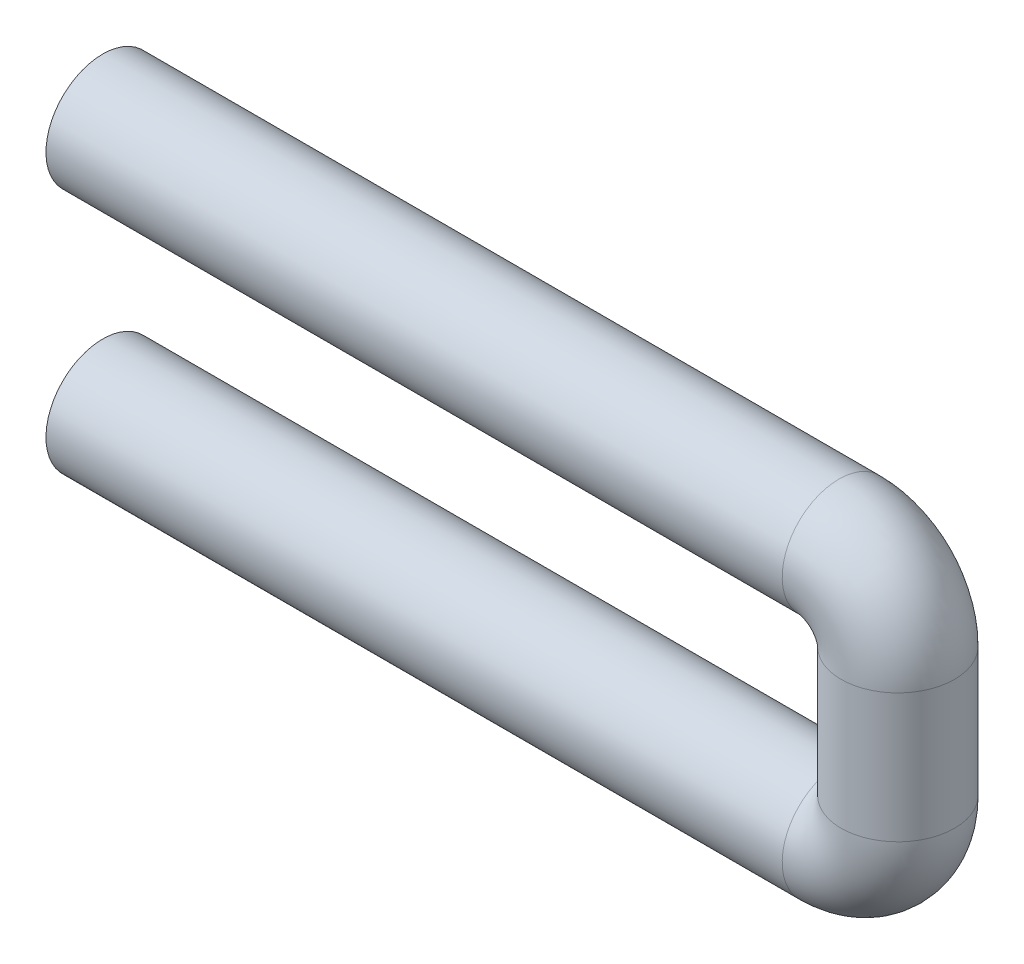
ISO-10303-21;
HEADER;
FILE_DESCRIPTION(('STEP AP214'),'2;1');
FILE_NAME('part.step','',(''),(''),'','','');
FILE_SCHEMA(('AUTOMOTIVE_DESIGN { 1 0 10303 214 1 1 1 1 }'));
ENDSEC;
DATA;
#1=APPLICATION_CONTEXT('core data for automotive mechanical design processes');
#2=APPLICATION_PROTOCOL_DEFINITION('international standard','automotive_design',2000,#1);
#3=PRODUCT_CONTEXT('',#1,'mechanical');
#4=PRODUCT('Part','Part','',(#3));
#5=PRODUCT_RELATED_PRODUCT_CATEGORY('part','',(#4));
#6=PRODUCT_DEFINITION_FORMATION('','',#4);
#7=PRODUCT_DEFINITION_CONTEXT('part definition',#1,'design');
#8=PRODUCT_DEFINITION('design','',#6,#7);
#9=PRODUCT_DEFINITION_SHAPE('','',#8);
#10=(LENGTH_UNIT() NAMED_UNIT(*) SI_UNIT(.MILLI.,.METRE.));
#11=(NAMED_UNIT(*) PLANE_ANGLE_UNIT() SI_UNIT($,.RADIAN.));
#12=(NAMED_UNIT(*) SI_UNIT($,.STERADIAN.) SOLID_ANGLE_UNIT());
#13=UNCERTAINTY_MEASURE_WITH_UNIT(LENGTH_MEASURE(1.E-05),#10,'distance_accuracy_value','');
#14=(GEOMETRIC_REPRESENTATION_CONTEXT(3) GLOBAL_UNCERTAINTY_ASSIGNED_CONTEXT((#13)) GLOBAL_UNIT_ASSIGNED_CONTEXT((#10,
#11,#12)) REPRESENTATION_CONTEXT('',''));
#15=CARTESIAN_POINT('',(0.,0.,0.));
#16=DIRECTION('',(0.,0.,1.));
#17=DIRECTION('',(1.,0.,0.));
#18=AXIS2_PLACEMENT_3D('',#15,#16,#17);
#19=CARTESIAN_POINT('',(10.3845432316119,-3.93310463849465,0.));
#20=DIRECTION('',(-1.,0.,0.));
#21=DIRECTION('',(0.,0.,1.));
#22=AXIS2_PLACEMENT_3D('',#19,#20,#21);
#23=CYLINDRICAL_SURFACE('',#22,1.3);
#24=CARTESIAN_POINT('',(10.3845432316119,-3.93310463849465,0.));
#25=DIRECTION('',(1.,0.,0.));
#26=DIRECTION('',(0.,1.,0.));
#27=AXIS2_PLACEMENT_3D('',#24,#25,#26);
#28=CIRCLE('',#27,1.3);
#29=CARTESIAN_POINT('',(10.3845432316119,-2.63310463849465,0.));
#30=VERTEX_POINT('',#29);
#31=EDGE_CURVE('E34',#30,#30,#28,.T.);
#32=ORIENTED_EDGE('',*,*,#31,.F.);
#33=EDGE_LOOP('',(#32));
#34=FACE_BOUND('',#33,.T.);
#35=CARTESIAN_POINT('',(-6.4854567683881,-3.93310463849465,0.));
#36=DIRECTION('',(1.,0.,0.));
#37=DIRECTION('',(0.,1.,0.));
#38=AXIS2_PLACEMENT_3D('',#35,#36,#37);
#39=CIRCLE('',#38,1.3);
#40=CARTESIAN_POINT('',(-6.48545676838814,-2.63310463849465,0.));
#41=VERTEX_POINT('',#40);
#42=EDGE_CURVE('E10',#41,#41,#39,.T.);
#43=ORIENTED_EDGE('',*,*,#42,.T.);
#44=EDGE_LOOP('',(#43));
#45=FACE_BOUND('',#44,.T.);
#46=ADVANCED_FACE('F28',(#34,#45),#23,.T.);
#47=CARTESIAN_POINT('',(10.3845432316119,-5.28310463849465,0.));
#48=DIRECTION('',(0.,0.,1.));
#49=DIRECTION('',(1.,0.,0.));
#50=AXIS2_PLACEMENT_3D('',#47,#48,#49);
#51=TOROIDAL_SURFACE('',#50,1.35,1.3);
#52=CARTESIAN_POINT('',(11.7345432316119,-5.28310463849466,0.));
#53=DIRECTION('',(0.,-1.,0.));
#54=DIRECTION('',(1.,0.,0.));
#55=AXIS2_PLACEMENT_3D('',#52,#53,#54);
#56=CIRCLE('',#55,1.3);
#57=CARTESIAN_POINT('',(13.0345432316119,-5.28310463849467,0.));
#58=VERTEX_POINT('',#57);
#59=EDGE_CURVE('E38',#58,#58,#56,.T.);
#60=CARTESIAN_POINT('',(10.3845432316119,-5.28310463849465,0.));
#61=DIRECTION('',(0.,0.,1.));
#62=DIRECTION('',(1.,0.,0.));
#63=AXIS2_PLACEMENT_3D('',#60,#61,#62);
#64=CIRCLE('',#63,2.65);
#65=EDGE_CURVE('',#58,#30,#64,.T.);
#66=ORIENTED_EDGE('',*,*,#59,.F.);
#67=ORIENTED_EDGE('',*,*,#31,.T.);
#68=ORIENTED_EDGE('',*,*,#65,.T.);
#69=ORIENTED_EDGE('',*,*,#65,.F.);
#70=EDGE_LOOP('',(#66,#68,#67,#69));
#71=FACE_BOUND('',#70,.T.);
#72=ADVANCED_FACE('F66',(#71),#51,.T.);
#73=CARTESIAN_POINT('',(11.7345432316119,-8.23774244494762,0.));
#74=DIRECTION('',(0.,1.,0.));
#75=DIRECTION('',(0.,0.,1.));
#76=AXIS2_PLACEMENT_3D('',#73,#74,#75);
#77=CYLINDRICAL_SURFACE('',#76,1.3);
#78=CARTESIAN_POINT('',(11.7345432316119,-8.23774244494762,0.));
#79=DIRECTION('',(0.,-1.,0.));
#80=DIRECTION('',(1.,0.,0.));
#81=AXIS2_PLACEMENT_3D('',#78,#79,#80);
#82=CIRCLE('',#81,1.3);
#83=CARTESIAN_POINT('',(13.0345432316119,-8.23774244494761,0.));
#84=VERTEX_POINT('',#83);
#85=EDGE_CURVE('E42',#84,#84,#82,.T.);
#86=ORIENTED_EDGE('',*,*,#85,.F.);
#87=EDGE_LOOP('',(#86));
#88=FACE_BOUND('',#87,.T.);
#89=ORIENTED_EDGE('',*,*,#59,.T.);
#90=EDGE_LOOP('',(#89));
#91=FACE_BOUND('',#90,.T.);
#92=ADVANCED_FACE('F60',(#88,#91),#77,.T.);
#93=CARTESIAN_POINT('',(10.3845432316119,-8.23774244494763,0.));
#94=DIRECTION('',(0.,0.,1.));
#95=DIRECTION('',(1.,0.,0.));
#96=AXIS2_PLACEMENT_3D('',#93,#94,#95);
#97=TOROIDAL_SURFACE('',#96,1.35,1.3);
#98=CARTESIAN_POINT('',(10.3845432316119,-9.58774244494763,0.));
#99=DIRECTION('',(-1.,0.,0.));
#100=DIRECTION('',(0.,-1.,0.));
#101=AXIS2_PLACEMENT_3D('',#98,#99,#100);
#102=CIRCLE('',#101,1.3);
#103=CARTESIAN_POINT('',(10.3845432316119,-10.8877424449476,0.));
#104=VERTEX_POINT('',#103);
#105=EDGE_CURVE('E47',#104,#104,#102,.T.);
#106=CARTESIAN_POINT('',(10.3845432316119,-8.23774244494763,0.));
#107=DIRECTION('',(0.,0.,1.));
#108=DIRECTION('',(1.,0.,0.));
#109=AXIS2_PLACEMENT_3D('',#106,#107,#108);
#110=CIRCLE('',#109,2.65);
#111=EDGE_CURVE('',#104,#84,#110,.T.);
#112=ORIENTED_EDGE('',*,*,#105,.F.);
#113=ORIENTED_EDGE('',*,*,#85,.T.);
#114=ORIENTED_EDGE('',*,*,#111,.T.);
#115=ORIENTED_EDGE('',*,*,#111,.F.);
#116=EDGE_LOOP('',(#112,#114,#113,#115));
#117=FACE_BOUND('',#116,.T.);
#118=ADVANCED_FACE('F57',(#117),#97,.T.);
#119=CARTESIAN_POINT('',(10.3845432316119,-9.58774244494763,0.));
#120=DIRECTION('',(-1.,0.,0.));
#121=DIRECTION('',(0.,-1.,0.));
#122=AXIS2_PLACEMENT_3D('',#119,#120,#121);
#123=CYLINDRICAL_SURFACE('',#122,1.3);
#124=ORIENTED_EDGE('',*,*,#105,.T.);
#125=EDGE_LOOP('',(#124));
#126=FACE_BOUND('',#125,.T.);
#127=CARTESIAN_POINT('',(-6.48545676838811,-9.58774244494763,0.));
#128=DIRECTION('',(-1.,0.,0.));
#129=DIRECTION('',(0.,-1.,0.));
#130=AXIS2_PLACEMENT_3D('',#127,#128,#129);
#131=CIRCLE('',#130,1.3);
#132=CARTESIAN_POINT('',(-6.48545676838811,-10.8877424449476,0.));
#133=VERTEX_POINT('',#132);
#134=EDGE_CURVE('E48',#133,#133,#131,.T.);
#135=ORIENTED_EDGE('',*,*,#134,.F.);
#136=EDGE_LOOP('',(#135));
#137=FACE_BOUND('',#136,.T.);
#138=ADVANCED_FACE('F54',(#126,#137),#123,.T.);
#139=CARTESIAN_POINT('',(-6.4854567683881,-3.93310463849465,0.));
#140=DIRECTION('',(1.,0.,0.));
#141=DIRECTION('',(0.,1.,0.));
#142=AXIS2_PLACEMENT_3D('',#139,#140,#141);
#143=PLANE('',#142);
#144=ORIENTED_EDGE('',*,*,#42,.F.);
#145=EDGE_LOOP('',(#144));
#146=FACE_BOUND('',#145,.T.);
#147=ADVANCED_FACE('F78',(#146),#143,.F.);
#148=CARTESIAN_POINT('',(-6.48545676838811,-9.58774244494763,0.));
#149=DIRECTION('',(-1.,0.,0.));
#150=DIRECTION('',(0.,-1.,0.));
#151=AXIS2_PLACEMENT_3D('',#148,#149,#150);
#152=PLANE('',#151);
#153=ORIENTED_EDGE('',*,*,#134,.T.);
#154=EDGE_LOOP('',(#153));
#155=FACE_BOUND('',#154,.T.);
#156=ADVANCED_FACE('F79',(#155),#152,.T.);
#157=CLOSED_SHELL('',(#46,#72,#92,#118,#138,#147,#156));
#158=MANIFOLD_SOLID_BREP('B2',#157);
#159=ADVANCED_BREP_SHAPE_REPRESENTATION('',(#18,#158),#14);
#160=SHAPE_DEFINITION_REPRESENTATION(#9,#159);
ENDSEC;
END-ISO-10303-21;
